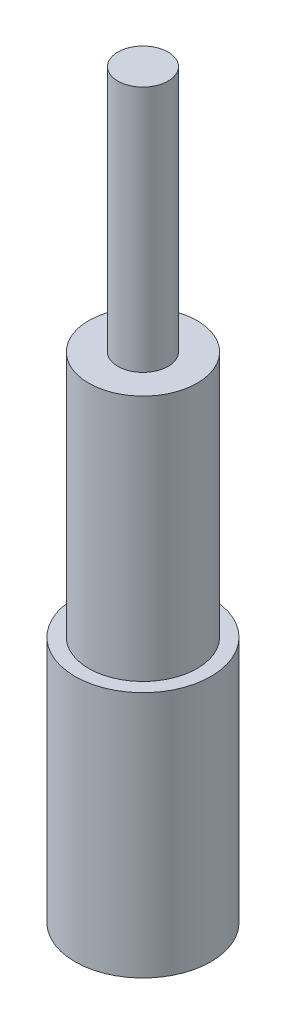
ISO-10303-21;
HEADER;
FILE_DESCRIPTION(('STEP AP214'),'2;1');
FILE_NAME('part.step','',(''),(''),'','','');
FILE_SCHEMA(('AUTOMOTIVE_DESIGN { 1 0 10303 214 1 1 1 1 }'));
ENDSEC;
DATA;
#1=APPLICATION_CONTEXT('core data for automotive mechanical design processes');
#2=APPLICATION_PROTOCOL_DEFINITION('international standard','automotive_design',2000,#1);
#3=PRODUCT_CONTEXT('',#1,'mechanical');
#4=PRODUCT('Part','Part','',(#3));
#5=PRODUCT_RELATED_PRODUCT_CATEGORY('part','',(#4));
#6=PRODUCT_DEFINITION_FORMATION('','',#4);
#7=PRODUCT_DEFINITION_CONTEXT('part definition',#1,'design');
#8=PRODUCT_DEFINITION('design','',#6,#7);
#9=PRODUCT_DEFINITION_SHAPE('','',#8);
#10=(LENGTH_UNIT() NAMED_UNIT(*) SI_UNIT(.MILLI.,.METRE.));
#11=(NAMED_UNIT(*) PLANE_ANGLE_UNIT() SI_UNIT($,.RADIAN.));
#12=(NAMED_UNIT(*) SI_UNIT($,.STERADIAN.) SOLID_ANGLE_UNIT());
#13=UNCERTAINTY_MEASURE_WITH_UNIT(LENGTH_MEASURE(1.E-05),#10,'distance_accuracy_value','');
#14=(GEOMETRIC_REPRESENTATION_CONTEXT(3) GLOBAL_UNCERTAINTY_ASSIGNED_CONTEXT((#13)) GLOBAL_UNIT_ASSIGNED_CONTEXT((#10,
#11,#12)) REPRESENTATION_CONTEXT('',''));
#15=CARTESIAN_POINT('',(0.,0.,0.));
#16=DIRECTION('',(0.,0.,1.));
#17=DIRECTION('',(1.,0.,0.));
#18=AXIS2_PLACEMENT_3D('',#15,#16,#17);
#19=CARTESIAN_POINT('',(0.,20.,0.));
#20=DIRECTION('',(0.,-1.,0.));
#21=DIRECTION('',(0.,0.,-1.));
#22=AXIS2_PLACEMENT_3D('',#19,#20,#21);
#23=CYLINDRICAL_SURFACE('',#22,5.5);
#24=CARTESIAN_POINT('',(0.,20.,0.));
#25=DIRECTION('',(0.,1.,0.));
#26=DIRECTION('',(0.,0.,1.));
#27=AXIS2_PLACEMENT_3D('',#24,#25,#26);
#28=CIRCLE('',#27,5.5);
#29=CARTESIAN_POINT('',(0.,20.,5.5));
#30=VERTEX_POINT('',#29);
#31=EDGE_CURVE('E51',#30,#30,#28,.T.);
#32=ORIENTED_EDGE('',*,*,#31,.F.);
#33=EDGE_LOOP('',(#32));
#34=FACE_BOUND('',#33,.T.);
#35=CARTESIAN_POINT('',(0.,0.,0.));
#36=DIRECTION('',(0.,1.,0.));
#37=DIRECTION('',(0.,0.,1.));
#38=AXIS2_PLACEMENT_3D('',#35,#36,#37);
#39=CIRCLE('',#38,5.5);
#40=CARTESIAN_POINT('',(0.,0.,5.5));
#41=VERTEX_POINT('',#40);
#42=EDGE_CURVE('E40',#41,#41,#39,.T.);
#43=ORIENTED_EDGE('',*,*,#42,.T.);
#44=EDGE_LOOP('',(#43));
#45=FACE_BOUND('',#44,.T.);
#46=ADVANCED_FACE('F37',(#34,#45),#23,.T.);
#47=CARTESIAN_POINT('',(0.,20.,0.));
#48=DIRECTION('',(0.,1.,0.));
#49=DIRECTION('',(0.,0.,1.));
#50=AXIS2_PLACEMENT_3D('',#47,#48,#49);
#51=PLANE('',#50);
#52=CARTESIAN_POINT('',(0.,20.,0.));
#53=DIRECTION('',(0.,1.,0.));
#54=DIRECTION('',(0.,0.,1.));
#55=AXIS2_PLACEMENT_3D('',#52,#53,#54);
#56=CIRCLE('',#55,4.38795866546347);
#57=CARTESIAN_POINT('',(0.,20.,4.38795866546347));
#58=VERTEX_POINT('',#57);
#59=EDGE_CURVE('E45',#58,#58,#56,.T.);
#60=ORIENTED_EDGE('',*,*,#59,.F.);
#61=EDGE_LOOP('',(#60));
#62=FACE_BOUND('',#61,.T.);
#63=ORIENTED_EDGE('',*,*,#31,.T.);
#64=EDGE_LOOP('',(#63));
#65=FACE_BOUND('',#64,.T.);
#66=ADVANCED_FACE('F71',(#62,#65),#51,.T.);
#67=CARTESIAN_POINT('',(0.,0.,0.));
#68=DIRECTION('',(0.,1.,0.));
#69=DIRECTION('',(0.,0.,1.));
#70=AXIS2_PLACEMENT_3D('',#67,#68,#69);
#71=PLANE('',#70);
#72=ORIENTED_EDGE('',*,*,#42,.F.);
#73=EDGE_LOOP('',(#72));
#74=FACE_BOUND('',#73,.T.);
#75=ADVANCED_FACE('F68',(#74),#71,.F.);
#76=CARTESIAN_POINT('',(0.,40.,0.));
#77=DIRECTION('',(0.,-1.,0.));
#78=DIRECTION('',(0.,0.,-1.));
#79=AXIS2_PLACEMENT_3D('',#76,#77,#78);
#80=CYLINDRICAL_SURFACE('',#79,4.38795866546347);
#81=CARTESIAN_POINT('',(0.,40.,0.));
#82=DIRECTION('',(0.,1.,0.));
#83=DIRECTION('',(0.,0.,1.));
#84=AXIS2_PLACEMENT_3D('',#81,#82,#83);
#85=CIRCLE('',#84,4.38795866546347);
#86=CARTESIAN_POINT('',(0.,40.,4.38795866546347));
#87=VERTEX_POINT('',#86);
#88=EDGE_CURVE('E56',#87,#87,#85,.T.);
#89=ORIENTED_EDGE('',*,*,#88,.F.);
#90=EDGE_LOOP('',(#89));
#91=FACE_BOUND('',#90,.T.);
#92=ORIENTED_EDGE('',*,*,#59,.T.);
#93=EDGE_LOOP('',(#92));
#94=FACE_BOUND('',#93,.T.);
#95=ADVANCED_FACE('F70',(#91,#94),#80,.T.);
#96=CARTESIAN_POINT('',(0.,40.,0.));
#97=DIRECTION('',(0.,1.,0.));
#98=DIRECTION('',(0.,0.,1.));
#99=AXIS2_PLACEMENT_3D('',#96,#97,#98);
#100=PLANE('',#99);
#101=CARTESIAN_POINT('',(0.,40.,0.));
#102=DIRECTION('',(0.,1.,0.));
#103=DIRECTION('',(0.,0.,1.));
#104=AXIS2_PLACEMENT_3D('',#101,#102,#103);
#105=CIRCLE('',#104,2.03575347500185);
#106=CARTESIAN_POINT('',(0.,40.,2.03575347500185));
#107=VERTEX_POINT('',#106);
#108=EDGE_CURVE('E10',#107,#107,#105,.T.);
#109=ORIENTED_EDGE('',*,*,#108,.F.);
#110=EDGE_LOOP('',(#109));
#111=FACE_BOUND('',#110,.T.);
#112=ORIENTED_EDGE('',*,*,#88,.T.);
#113=EDGE_LOOP('',(#112));
#114=FACE_BOUND('',#113,.T.);
#115=ADVANCED_FACE('F76',(#111,#114),#100,.T.);
#116=CARTESIAN_POINT('',(0.,60.,0.));
#117=DIRECTION('',(0.,-1.,0.));
#118=DIRECTION('',(0.,0.,-1.));
#119=AXIS2_PLACEMENT_3D('',#116,#117,#118);
#120=CYLINDRICAL_SURFACE('',#119,2.03575347500185);
#121=CARTESIAN_POINT('',(0.,60.,0.));
#122=DIRECTION('',(0.,1.,0.));
#123=DIRECTION('',(0.,0.,1.));
#124=AXIS2_PLACEMENT_3D('',#121,#122,#123);
#125=CIRCLE('',#124,2.03575347500185);
#126=CARTESIAN_POINT('',(0.,60.,2.03575347500185));
#127=VERTEX_POINT('',#126);
#128=EDGE_CURVE('E55',#127,#127,#125,.T.);
#129=ORIENTED_EDGE('',*,*,#128,.F.);
#130=EDGE_LOOP('',(#129));
#131=FACE_BOUND('',#130,.T.);
#132=ORIENTED_EDGE('',*,*,#108,.T.);
#133=EDGE_LOOP('',(#132));
#134=FACE_BOUND('',#133,.T.);
#135=ADVANCED_FACE('F106',(#131,#134),#120,.T.);
#136=CARTESIAN_POINT('',(0.,60.,0.));
#137=DIRECTION('',(0.,1.,0.));
#138=DIRECTION('',(0.,0.,1.));
#139=AXIS2_PLACEMENT_3D('',#136,#137,#138);
#140=PLANE('',#139);
#141=ORIENTED_EDGE('',*,*,#128,.T.);
#142=EDGE_LOOP('',(#141));
#143=FACE_BOUND('',#142,.T.);
#144=ADVANCED_FACE('F116',(#143),#140,.T.);
#145=CLOSED_SHELL('',(#46,#66,#75,#95,#115,#135,#144));
#146=MANIFOLD_SOLID_BREP('B2',#145);
#147=ADVANCED_BREP_SHAPE_REPRESENTATION('',(#18,#146),#14);
#148=SHAPE_DEFINITION_REPRESENTATION(#9,#147);
ENDSEC;
END-ISO-10303-21;
